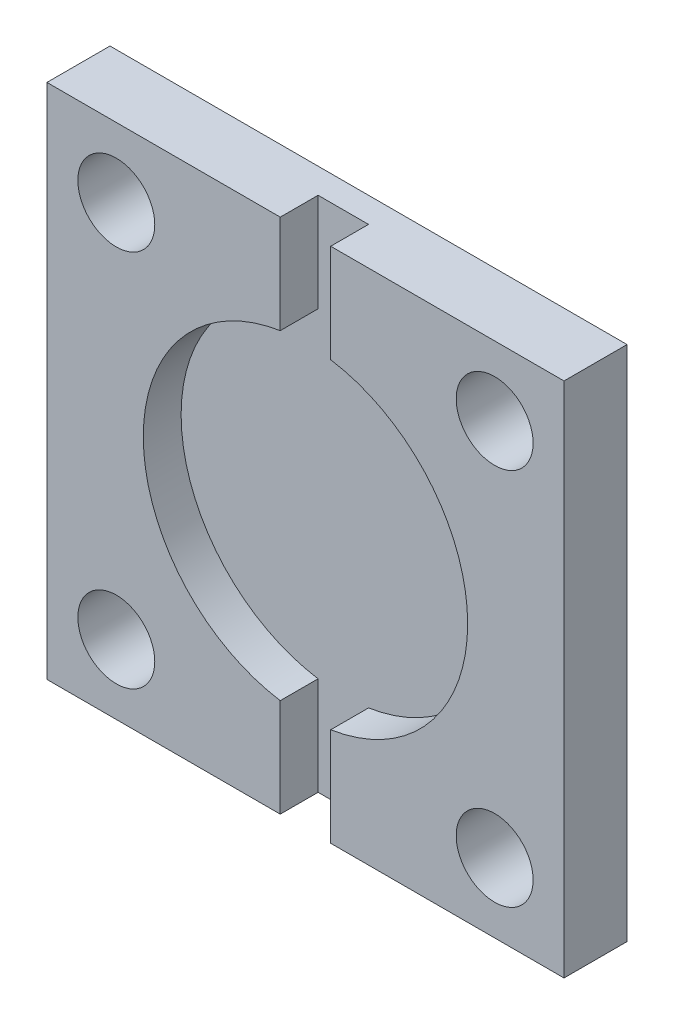
ISO-10303-21;
HEADER;
FILE_DESCRIPTION(('STEP AP214'),'2;1');
FILE_NAME('part.step','',(''),(''),'','','');
FILE_SCHEMA(('AUTOMOTIVE_DESIGN { 1 0 10303 214 1 1 1 1 }'));
ENDSEC;
DATA;
#1=APPLICATION_CONTEXT('core data for automotive mechanical design processes');
#2=APPLICATION_PROTOCOL_DEFINITION('international standard','automotive_design',2000,#1);
#3=PRODUCT_CONTEXT('',#1,'mechanical');
#4=PRODUCT('Part','Part','',(#3));
#5=PRODUCT_RELATED_PRODUCT_CATEGORY('part','',(#4));
#6=PRODUCT_DEFINITION_FORMATION('','',#4);
#7=PRODUCT_DEFINITION_CONTEXT('part definition',#1,'design');
#8=PRODUCT_DEFINITION('design','',#6,#7);
#9=PRODUCT_DEFINITION_SHAPE('','',#8);
#10=(LENGTH_UNIT() NAMED_UNIT(*) SI_UNIT(.MILLI.,.METRE.));
#11=(NAMED_UNIT(*) PLANE_ANGLE_UNIT() SI_UNIT($,.RADIAN.));
#12=(NAMED_UNIT(*) SI_UNIT($,.STERADIAN.) SOLID_ANGLE_UNIT());
#13=UNCERTAINTY_MEASURE_WITH_UNIT(LENGTH_MEASURE(1.E-05),#10,'distance_accuracy_value','');
#14=(GEOMETRIC_REPRESENTATION_CONTEXT(3) GLOBAL_UNCERTAINTY_ASSIGNED_CONTEXT((#13)) GLOBAL_UNIT_ASSIGNED_CONTEXT((#10,
#11,#12)) REPRESENTATION_CONTEXT('',''));
#15=CARTESIAN_POINT('',(0.,0.,0.));
#16=DIRECTION('',(0.,0.,1.));
#17=DIRECTION('',(1.,0.,0.));
#18=AXIS2_PLACEMENT_3D('',#15,#16,#17);
#19=CARTESIAN_POINT('',(-20.5,20.5,2.));
#20=DIRECTION('',(0.,0.,1.));
#21=DIRECTION('',(1.,0.,0.));
#22=AXIS2_PLACEMENT_3D('',#19,#20,#21);
#23=CYLINDRICAL_SURFACE('',#22,12.86);
#24=CARTESIAN_POINT('',(-20.5,20.5,5.));
#25=DIRECTION('',(0.,0.,1.));
#26=DIRECTION('',(1.,0.,0.));
#27=AXIS2_PLACEMENT_3D('',#24,#25,#26);
#28=CIRCLE('',#27,12.86);
#29=CARTESIAN_POINT('',(-18.5,7.79647293071723,5.));
#30=VERTEX_POINT('',#29);
#31=CARTESIAN_POINT('',(-18.5,33.2035270692828,5.));
#32=VERTEX_POINT('',#31);
#33=EDGE_CURVE('E173',#30,#32,#28,.T.);
#34=ORIENTED_EDGE('',*,*,#33,.T.);
#35=DIRECTION('',(0.,0.,1.));
#36=VECTOR('',#35,1.);
#37=CARTESIAN_POINT('',(-18.5,33.2035270692828,2.));
#38=LINE('',#37,#36);
#39=CARTESIAN_POINT('',(-18.5,33.2035270692828,2.));
#40=VERTEX_POINT('',#39);
#41=EDGE_CURVE('E155',#32,#40,#38,.F.);
#42=ORIENTED_EDGE('',*,*,#41,.T.);
#43=CARTESIAN_POINT('',(-20.5,20.5,2.));
#44=DIRECTION('',(0.,0.,1.));
#45=DIRECTION('',(1.,0.,0.));
#46=AXIS2_PLACEMENT_3D('',#43,#44,#45);
#47=CIRCLE('',#46,12.86);
#48=CARTESIAN_POINT('',(-18.5,7.79647293071723,2.));
#49=VERTEX_POINT('',#48);
#50=EDGE_CURVE('E162',#49,#40,#47,.T.);
#51=ORIENTED_EDGE('',*,*,#50,.F.);
#52=DIRECTION('',(0.,0.,1.));
#53=VECTOR('',#52,1.);
#54=CARTESIAN_POINT('',(-18.5,7.79647293071723,2.));
#55=LINE('',#54,#53);
#56=EDGE_CURVE('E478',#49,#30,#55,.T.);
#57=ORIENTED_EDGE('',*,*,#56,.T.);
#58=EDGE_LOOP('',(#34,#42,#51,#57));
#59=FACE_BOUND('',#58,.T.);
#60=ADVANCED_FACE('F39',(#59),#23,.F.);
#61=CARTESIAN_POINT('',(0.,0.,5.));
#62=DIRECTION('',(0.,0.,1.));
#63=DIRECTION('',(1.,0.,0.));
#64=AXIS2_PLACEMENT_3D('',#61,#62,#63);
#65=PLANE('',#64);
#66=CARTESIAN_POINT('',(-22.5,33.2035270692828,5.));
#67=VERTEX_POINT('',#66);
#68=CARTESIAN_POINT('',(-22.5,7.79647293071723,5.));
#69=VERTEX_POINT('',#68);
#70=EDGE_CURVE('E168',#67,#69,#28,.T.);
#71=ORIENTED_EDGE('',*,*,#70,.F.);
#72=DIRECTION('',(0.,-1.,0.));
#73=VECTOR('',#72,1.);
#74=CARTESIAN_POINT('',(-22.5,41.,5.));
#75=LINE('',#74,#73);
#76=CARTESIAN_POINT('',(-22.5,41.,5.));
#77=VERTEX_POINT('',#76);
#78=EDGE_CURVE('E148',#77,#67,#75,.T.);
#79=ORIENTED_EDGE('',*,*,#78,.F.);
#80=DIRECTION('',(-1.,0.,0.));
#81=VECTOR('',#80,1.);
#82=CARTESIAN_POINT('',(0.,41.,5.));
#83=LINE('',#82,#81);
#84=CARTESIAN_POINT('',(-41.,41.,5.));
#85=VERTEX_POINT('',#84);
#86=EDGE_CURVE('E84',#77,#85,#83,.T.);
#87=ORIENTED_EDGE('',*,*,#86,.T.);
#88=DIRECTION('',(0.,1.,0.));
#89=VECTOR('',#88,1.);
#90=CARTESIAN_POINT('',(-41.,0.,5.));
#91=LINE('',#90,#89);
#92=CARTESIAN_POINT('',(-41.,0.,5.));
#93=VERTEX_POINT('',#92);
#94=EDGE_CURVE('E177',#93,#85,#91,.T.);
#95=ORIENTED_EDGE('',*,*,#94,.F.);
#96=DIRECTION('',(-1.,0.,0.));
#97=VECTOR('',#96,1.);
#98=CARTESIAN_POINT('',(0.,0.,5.));
#99=LINE('',#98,#97);
#100=CARTESIAN_POINT('',(-22.5,0.,5.));
#101=VERTEX_POINT('',#100);
#102=EDGE_CURVE('E57',#101,#93,#99,.T.);
#103=ORIENTED_EDGE('',*,*,#102,.F.);
#104=DIRECTION('',(0.,-1.,0.));
#105=VECTOR('',#104,1.);
#106=CARTESIAN_POINT('',(-22.5,7.7277801459574,5.));
#107=LINE('',#106,#105);
#108=EDGE_CURVE('E225',#69,#101,#107,.T.);
#109=ORIENTED_EDGE('',*,*,#108,.F.);
#110=EDGE_LOOP('',(#71,#79,#87,#95,#103,#109));
#111=FACE_BOUND('',#110,.T.);
#112=CARTESIAN_POINT('',(-35.5,5.49999999999999,5.));
#113=DIRECTION('',(0.,0.,1.));
#114=DIRECTION('',(1.,0.,0.));
#115=AXIS2_PLACEMENT_3D('',#112,#113,#114);
#116=CIRCLE('',#115,3.05);
#117=CARTESIAN_POINT('',(-32.45,5.49999999999999,5.));
#118=VERTEX_POINT('',#117);
#119=EDGE_CURVE('E171',#118,#118,#116,.T.);
#120=ORIENTED_EDGE('',*,*,#119,.F.);
#121=EDGE_LOOP('',(#120));
#122=FACE_BOUND('',#121,.T.);
#123=CARTESIAN_POINT('',(-35.5,35.5,5.));
#124=DIRECTION('',(0.,0.,1.));
#125=DIRECTION('',(1.,0.,0.));
#126=AXIS2_PLACEMENT_3D('',#123,#124,#125);
#127=CIRCLE('',#126,3.05);
#128=CARTESIAN_POINT('',(-32.45,35.5,5.));
#129=VERTEX_POINT('',#128);
#130=EDGE_CURVE('E253',#129,#129,#127,.T.);
#131=ORIENTED_EDGE('',*,*,#130,.F.);
#132=EDGE_LOOP('',(#131));
#133=FACE_BOUND('',#132,.T.);
#134=ADVANCED_FACE('F265',(#111,#122,#133),#65,.T.);
#135=CARTESIAN_POINT('',(-41.,0.,5.));
#136=DIRECTION('',(-1.,0.,0.));
#137=DIRECTION('',(0.,0.,1.));
#138=AXIS2_PLACEMENT_3D('',#135,#136,#137);
#139=PLANE('',#138);
#140=DIRECTION('',(0.,1.,0.));
#141=VECTOR('',#140,1.);
#142=CARTESIAN_POINT('',(-41.,0.,0.));
#143=LINE('',#142,#141);
#144=CARTESIAN_POINT('',(-41.,0.,0.));
#145=VERTEX_POINT('',#144);
#146=CARTESIAN_POINT('',(-41.,41.,0.));
#147=VERTEX_POINT('',#146);
#148=EDGE_CURVE('E161',#145,#147,#143,.T.);
#149=ORIENTED_EDGE('',*,*,#148,.F.);
#150=DIRECTION('',(0.,0.,-1.));
#151=VECTOR('',#150,1.);
#152=CARTESIAN_POINT('',(-41.,0.,5.));
#153=LINE('',#152,#151);
#154=EDGE_CURVE('E11',#93,#145,#153,.T.);
#155=ORIENTED_EDGE('',*,*,#154,.F.);
#156=ORIENTED_EDGE('',*,*,#94,.T.);
#157=DIRECTION('',(0.,0.,-1.));
#158=VECTOR('',#157,1.);
#159=CARTESIAN_POINT('',(-41.,41.,5.));
#160=LINE('',#159,#158);
#161=EDGE_CURVE('E43',#85,#147,#160,.T.);
#162=ORIENTED_EDGE('',*,*,#161,.T.);
#163=EDGE_LOOP('',(#149,#155,#156,#162));
#164=FACE_BOUND('',#163,.T.);
#165=ADVANCED_FACE('F41',(#164),#139,.T.);
#166=CARTESIAN_POINT('',(0.,0.,5.));
#167=DIRECTION('',(0.,-1.,0.));
#168=DIRECTION('',(0.,0.,-1.));
#169=AXIS2_PLACEMENT_3D('',#166,#167,#168);
#170=PLANE('',#169);
#171=DIRECTION('',(1.,0.,0.));
#172=VECTOR('',#171,1.);
#173=CARTESIAN_POINT('',(-22.,0.,2.));
#174=LINE('',#173,#172);
#175=CARTESIAN_POINT('',(-22.5,0.,2.));
#176=VERTEX_POINT('',#175);
#177=CARTESIAN_POINT('',(-18.5,0.,2.));
#178=VERTEX_POINT('',#177);
#179=EDGE_CURVE('E237',#176,#178,#174,.T.);
#180=ORIENTED_EDGE('',*,*,#179,.F.);
#181=DIRECTION('',(0.,0.,-1.));
#182=VECTOR('',#181,1.);
#183=CARTESIAN_POINT('',(-22.5,0.,5.));
#184=LINE('',#183,#182);
#185=EDGE_CURVE('E219',#101,#176,#184,.T.);
#186=ORIENTED_EDGE('',*,*,#185,.F.);
#187=ORIENTED_EDGE('',*,*,#102,.T.);
#188=ORIENTED_EDGE('',*,*,#154,.T.);
#189=DIRECTION('',(-1.,0.,0.));
#190=VECTOR('',#189,1.);
#191=CARTESIAN_POINT('',(0.,0.,0.));
#192=LINE('',#191,#190);
#193=CARTESIAN_POINT('',(0.,0.,0.));
#194=VERTEX_POINT('',#193);
#195=EDGE_CURVE('E180',#194,#145,#192,.T.);
#196=ORIENTED_EDGE('',*,*,#195,.F.);
#197=DIRECTION('',(0.,0.,-1.));
#198=VECTOR('',#197,1.);
#199=CARTESIAN_POINT('',(0.,0.,5.));
#200=LINE('',#199,#198);
#201=CARTESIAN_POINT('',(0.,0.,5.));
#202=VERTEX_POINT('',#201);
#203=EDGE_CURVE('E49',#202,#194,#200,.T.);
#204=ORIENTED_EDGE('',*,*,#203,.F.);
#205=CARTESIAN_POINT('',(-18.5,0.,5.));
#206=VERTEX_POINT('',#205);
#207=EDGE_CURVE('E186',#202,#206,#99,.T.);
#208=ORIENTED_EDGE('',*,*,#207,.T.);
#209=DIRECTION('',(0.,0.,1.));
#210=VECTOR('',#209,1.);
#211=CARTESIAN_POINT('',(-18.5,0.,2.));
#212=LINE('',#211,#210);
#213=EDGE_CURVE('E222',#178,#206,#212,.T.);
#214=ORIENTED_EDGE('',*,*,#213,.F.);
#215=EDGE_LOOP('',(#180,#186,#187,#188,#196,#204,#208,#214));
#216=FACE_BOUND('',#215,.T.);
#217=ADVANCED_FACE('F205',(#216),#170,.T.);
#218=CARTESIAN_POINT('',(0.,0.,5.));
#219=DIRECTION('',(-1.,0.,0.));
#220=DIRECTION('',(0.,0.,1.));
#221=AXIS2_PLACEMENT_3D('',#218,#219,#220);
#222=PLANE('',#221);
#223=DIRECTION('',(0.,1.,0.));
#224=VECTOR('',#223,1.);
#225=CARTESIAN_POINT('',(0.,0.,0.));
#226=LINE('',#225,#224);
#227=CARTESIAN_POINT('',(0.,41.,0.));
#228=VERTEX_POINT('',#227);
#229=EDGE_CURVE('E191',#194,#228,#226,.T.);
#230=ORIENTED_EDGE('',*,*,#229,.T.);
#231=DIRECTION('',(0.,0.,-1.));
#232=VECTOR('',#231,1.);
#233=CARTESIAN_POINT('',(0.,41.,5.));
#234=LINE('',#233,#232);
#235=CARTESIAN_POINT('',(0.,41.,5.));
#236=VERTEX_POINT('',#235);
#237=EDGE_CURVE('E195',#236,#228,#234,.T.);
#238=ORIENTED_EDGE('',*,*,#237,.F.);
#239=DIRECTION('',(0.,1.,0.));
#240=VECTOR('',#239,1.);
#241=CARTESIAN_POINT('',(0.,0.,5.));
#242=LINE('',#241,#240);
#243=EDGE_CURVE('E184',#202,#236,#242,.T.);
#244=ORIENTED_EDGE('',*,*,#243,.F.);
#245=ORIENTED_EDGE('',*,*,#203,.T.);
#246=EDGE_LOOP('',(#230,#238,#244,#245));
#247=FACE_BOUND('',#246,.T.);
#248=ADVANCED_FACE('F208',(#247),#222,.F.);
#249=CARTESIAN_POINT('',(0.,41.,5.));
#250=DIRECTION('',(0.,-1.,0.));
#251=DIRECTION('',(0.,0.,-1.));
#252=AXIS2_PLACEMENT_3D('',#249,#250,#251);
#253=PLANE('',#252);
#254=DIRECTION('',(0.,0.,1.));
#255=VECTOR('',#254,1.);
#256=CARTESIAN_POINT('',(-22.5,41.,2.));
#257=LINE('',#256,#255);
#258=CARTESIAN_POINT('',(-22.5,41.,2.));
#259=VERTEX_POINT('',#258);
#260=EDGE_CURVE('E147',#259,#77,#257,.T.);
#261=ORIENTED_EDGE('',*,*,#260,.F.);
#262=DIRECTION('',(-1.,0.,0.));
#263=VECTOR('',#262,1.);
#264=CARTESIAN_POINT('',(-19.,41.,2.));
#265=LINE('',#264,#263);
#266=CARTESIAN_POINT('',(-18.5,41.,2.));
#267=VERTEX_POINT('',#266);
#268=EDGE_CURVE('E144',#267,#259,#265,.T.);
#269=ORIENTED_EDGE('',*,*,#268,.F.);
#270=DIRECTION('',(0.,0.,-1.));
#271=VECTOR('',#270,1.);
#272=CARTESIAN_POINT('',(-18.5,41.,5.));
#273=LINE('',#272,#271);
#274=CARTESIAN_POINT('',(-18.5,41.,5.));
#275=VERTEX_POINT('',#274);
#276=EDGE_CURVE('E232',#275,#267,#273,.T.);
#277=ORIENTED_EDGE('',*,*,#276,.F.);
#278=EDGE_CURVE('E181',#236,#275,#83,.T.);
#279=ORIENTED_EDGE('',*,*,#278,.F.);
#280=ORIENTED_EDGE('',*,*,#237,.T.);
#281=DIRECTION('',(-1.,0.,0.));
#282=VECTOR('',#281,1.);
#283=CARTESIAN_POINT('',(0.,41.,0.));
#284=LINE('',#283,#282);
#285=EDGE_CURVE('E165',#228,#147,#284,.T.);
#286=ORIENTED_EDGE('',*,*,#285,.T.);
#287=ORIENTED_EDGE('',*,*,#161,.F.);
#288=ORIENTED_EDGE('',*,*,#86,.F.);
#289=EDGE_LOOP('',(#261,#269,#277,#279,#280,#286,#287,#288));
#290=FACE_BOUND('',#289,.T.);
#291=ADVANCED_FACE('F202',(#290),#253,.F.);
#292=DIRECTION('',(0.,1.,0.));
#293=VECTOR('',#292,1.);
#294=CARTESIAN_POINT('',(-18.5,33.2722198540426,5.));
#295=LINE('',#294,#293);
#296=EDGE_CURVE('E230',#32,#275,#295,.T.);
#297=ORIENTED_EDGE('',*,*,#296,.F.);
#298=ORIENTED_EDGE('',*,*,#33,.F.);
#299=DIRECTION('',(0.,1.,0.));
#300=VECTOR('',#299,1.);
#301=CARTESIAN_POINT('',(-18.5,0.,5.));
#302=LINE('',#301,#300);
#303=EDGE_CURVE('E214',#206,#30,#302,.T.);
#304=ORIENTED_EDGE('',*,*,#303,.F.);
#305=ORIENTED_EDGE('',*,*,#207,.F.);
#306=ORIENTED_EDGE('',*,*,#243,.T.);
#307=ORIENTED_EDGE('',*,*,#278,.T.);
#308=EDGE_LOOP('',(#297,#298,#304,#305,#306,#307));
#309=FACE_BOUND('',#308,.T.);
#310=CARTESIAN_POINT('',(-5.5,35.5,5.));
#311=DIRECTION('',(0.,0.,1.));
#312=DIRECTION('',(1.,0.,0.));
#313=AXIS2_PLACEMENT_3D('',#310,#311,#312);
#314=CIRCLE('',#313,3.05);
#315=CARTESIAN_POINT('',(-2.45,35.5,5.));
#316=VERTEX_POINT('',#315);
#317=EDGE_CURVE('E247',#316,#316,#314,.T.);
#318=ORIENTED_EDGE('',*,*,#317,.F.);
#319=EDGE_LOOP('',(#318));
#320=FACE_BOUND('',#319,.T.);
#321=CARTESIAN_POINT('',(-5.5,5.49999999999999,5.));
#322=DIRECTION('',(0.,0.,1.));
#323=DIRECTION('',(1.,0.,0.));
#324=AXIS2_PLACEMENT_3D('',#321,#322,#323);
#325=CIRCLE('',#324,3.05);
#326=CARTESIAN_POINT('',(-2.45,5.49999999999999,5.));
#327=VERTEX_POINT('',#326);
#328=EDGE_CURVE('E241',#327,#327,#325,.T.);
#329=ORIENTED_EDGE('',*,*,#328,.F.);
#330=EDGE_LOOP('',(#329));
#331=FACE_BOUND('',#330,.T.);
#332=ADVANCED_FACE('F211',(#309,#320,#331),#65,.T.);
#333=CARTESIAN_POINT('',(0.,0.,0.));
#334=DIRECTION('',(0.,0.,1.));
#335=DIRECTION('',(1.,0.,0.));
#336=AXIS2_PLACEMENT_3D('',#333,#334,#335);
#337=PLANE('',#336);
#338=CARTESIAN_POINT('',(-35.5,35.5,0.));
#339=DIRECTION('',(0.,0.,1.));
#340=DIRECTION('',(1.,0.,0.));
#341=AXIS2_PLACEMENT_3D('',#338,#339,#340);
#342=CIRCLE('',#341,3.05);
#343=CARTESIAN_POINT('',(-32.45,35.5,0.));
#344=VERTEX_POINT('',#343);
#345=EDGE_CURVE('E240',#344,#344,#342,.T.);
#346=ORIENTED_EDGE('',*,*,#345,.T.);
#347=EDGE_LOOP('',(#346));
#348=FACE_BOUND('',#347,.T.);
#349=CARTESIAN_POINT('',(-5.5,35.5,0.));
#350=DIRECTION('',(0.,0.,1.));
#351=DIRECTION('',(1.,0.,0.));
#352=AXIS2_PLACEMENT_3D('',#349,#350,#351);
#353=CIRCLE('',#352,3.05);
#354=CARTESIAN_POINT('',(-2.45,35.5,0.));
#355=VERTEX_POINT('',#354);
#356=EDGE_CURVE('E250',#355,#355,#353,.T.);
#357=ORIENTED_EDGE('',*,*,#356,.T.);
#358=EDGE_LOOP('',(#357));
#359=FACE_BOUND('',#358,.T.);
#360=CARTESIAN_POINT('',(-5.5,5.49999999999999,0.));
#361=DIRECTION('',(0.,0.,1.));
#362=DIRECTION('',(1.,0.,0.));
#363=AXIS2_PLACEMENT_3D('',#360,#361,#362);
#364=CIRCLE('',#363,3.05);
#365=CARTESIAN_POINT('',(-2.45,5.49999999999999,0.));
#366=VERTEX_POINT('',#365);
#367=EDGE_CURVE('E244',#366,#366,#364,.T.);
#368=ORIENTED_EDGE('',*,*,#367,.T.);
#369=EDGE_LOOP('',(#368));
#370=FACE_BOUND('',#369,.T.);
#371=CARTESIAN_POINT('',(-35.5,5.49999999999999,0.));
#372=DIRECTION('',(0.,0.,1.));
#373=DIRECTION('',(1.,0.,0.));
#374=AXIS2_PLACEMENT_3D('',#371,#372,#373);
#375=CIRCLE('',#374,3.05);
#376=CARTESIAN_POINT('',(-32.45,5.49999999999999,0.));
#377=VERTEX_POINT('',#376);
#378=EDGE_CURVE('E176',#377,#377,#375,.T.);
#379=ORIENTED_EDGE('',*,*,#378,.T.);
#380=EDGE_LOOP('',(#379));
#381=FACE_BOUND('',#380,.T.);
#382=ORIENTED_EDGE('',*,*,#148,.T.);
#383=ORIENTED_EDGE('',*,*,#285,.F.);
#384=ORIENTED_EDGE('',*,*,#229,.F.);
#385=ORIENTED_EDGE('',*,*,#195,.T.);
#386=EDGE_LOOP('',(#382,#383,#384,#385));
#387=FACE_BOUND('',#386,.T.);
#388=ADVANCED_FACE('F204',(#348,#359,#370,#381,#387),#337,.F.);
#389=CARTESIAN_POINT('',(-22.5,33.2035270692828,2.));
#390=VERTEX_POINT('',#389);
#391=CARTESIAN_POINT('',(-22.5,7.79647293071723,2.));
#392=VERTEX_POINT('',#391);
#393=EDGE_CURVE('E141',#390,#392,#47,.T.);
#394=ORIENTED_EDGE('',*,*,#393,.F.);
#395=DIRECTION('',(0.,0.,1.));
#396=VECTOR('',#395,1.);
#397=CARTESIAN_POINT('',(-22.5,33.2035270692828,2.));
#398=LINE('',#397,#396);
#399=EDGE_CURVE('E151',#390,#67,#398,.T.);
#400=ORIENTED_EDGE('',*,*,#399,.T.);
#401=ORIENTED_EDGE('',*,*,#70,.T.);
#402=DIRECTION('',(0.,0.,1.));
#403=VECTOR('',#402,1.);
#404=CARTESIAN_POINT('',(-22.5,7.79647293071723,2.));
#405=LINE('',#404,#403);
#406=EDGE_CURVE('E160',#69,#392,#405,.F.);
#407=ORIENTED_EDGE('',*,*,#406,.T.);
#408=EDGE_LOOP('',(#394,#400,#401,#407));
#409=FACE_BOUND('',#408,.T.);
#410=ADVANCED_FACE('F158',(#409),#23,.F.);
#411=CARTESIAN_POINT('',(-20.5,20.5,2.));
#412=DIRECTION('',(0.,0.,1.));
#413=DIRECTION('',(1.,0.,0.));
#414=AXIS2_PLACEMENT_3D('',#411,#412,#413);
#415=PLANE('',#414);
#416=DIRECTION('',(0.,1.,0.));
#417=VECTOR('',#416,1.);
#418=CARTESIAN_POINT('',(-22.5,33.2722198540426,2.));
#419=LINE('',#418,#417);
#420=EDGE_CURVE('E136',#390,#259,#419,.T.);
#421=ORIENTED_EDGE('',*,*,#420,.F.);
#422=ORIENTED_EDGE('',*,*,#393,.T.);
#423=DIRECTION('',(0.,1.,0.));
#424=VECTOR('',#423,1.);
#425=CARTESIAN_POINT('',(-22.5,0.,2.));
#426=LINE('',#425,#424);
#427=EDGE_CURVE('E472',#176,#392,#426,.T.);
#428=ORIENTED_EDGE('',*,*,#427,.F.);
#429=ORIENTED_EDGE('',*,*,#179,.T.);
#430=DIRECTION('',(0.,-1.,0.));
#431=VECTOR('',#430,1.);
#432=CARTESIAN_POINT('',(-18.5,7.7277801459574,2.));
#433=LINE('',#432,#431);
#434=EDGE_CURVE('E218',#49,#178,#433,.T.);
#435=ORIENTED_EDGE('',*,*,#434,.F.);
#436=ORIENTED_EDGE('',*,*,#50,.T.);
#437=DIRECTION('',(0.,-1.,0.));
#438=VECTOR('',#437,1.);
#439=CARTESIAN_POINT('',(-18.5,41.,2.));
#440=LINE('',#439,#438);
#441=EDGE_CURVE('E235',#267,#40,#440,.T.);
#442=ORIENTED_EDGE('',*,*,#441,.F.);
#443=ORIENTED_EDGE('',*,*,#268,.T.);
#444=EDGE_LOOP('',(#421,#422,#428,#429,#435,#436,#442,#443));
#445=FACE_BOUND('',#444,.T.);
#446=ADVANCED_FACE('F138',(#445),#415,.T.);
#447=CARTESIAN_POINT('',(-35.5,5.49999999999999,0.));
#448=DIRECTION('',(0.,0.,1.));
#449=DIRECTION('',(1.,0.,0.));
#450=AXIS2_PLACEMENT_3D('',#447,#448,#449);
#451=CYLINDRICAL_SURFACE('',#450,3.05);
#452=ORIENTED_EDGE('',*,*,#378,.F.);
#453=EDGE_LOOP('',(#452));
#454=FACE_BOUND('',#453,.T.);
#455=ORIENTED_EDGE('',*,*,#119,.T.);
#456=EDGE_LOOP('',(#455));
#457=FACE_BOUND('',#456,.T.);
#458=ADVANCED_FACE('F263',(#454,#457),#451,.F.);
#459=CARTESIAN_POINT('',(-5.5,5.49999999999999,0.));
#460=DIRECTION('',(0.,0.,1.));
#461=DIRECTION('',(1.,0.,0.));
#462=AXIS2_PLACEMENT_3D('',#459,#460,#461);
#463=CYLINDRICAL_SURFACE('',#462,3.05);
#464=ORIENTED_EDGE('',*,*,#367,.F.);
#465=EDGE_LOOP('',(#464));
#466=FACE_BOUND('',#465,.T.);
#467=ORIENTED_EDGE('',*,*,#328,.T.);
#468=EDGE_LOOP('',(#467));
#469=FACE_BOUND('',#468,.T.);
#470=ADVANCED_FACE('F285',(#466,#469),#463,.F.);
#471=CARTESIAN_POINT('',(-5.5,35.5,0.));
#472=DIRECTION('',(0.,0.,1.));
#473=DIRECTION('',(1.,0.,0.));
#474=AXIS2_PLACEMENT_3D('',#471,#472,#473);
#475=CYLINDRICAL_SURFACE('',#474,3.05);
#476=ORIENTED_EDGE('',*,*,#356,.F.);
#477=EDGE_LOOP('',(#476));
#478=FACE_BOUND('',#477,.T.);
#479=ORIENTED_EDGE('',*,*,#317,.T.);
#480=EDGE_LOOP('',(#479));
#481=FACE_BOUND('',#480,.T.);
#482=ADVANCED_FACE('F274',(#478,#481),#475,.F.);
#483=CARTESIAN_POINT('',(-35.5,35.5,0.));
#484=DIRECTION('',(0.,0.,1.));
#485=DIRECTION('',(1.,0.,0.));
#486=AXIS2_PLACEMENT_3D('',#483,#484,#485);
#487=CYLINDRICAL_SURFACE('',#486,3.05);
#488=ORIENTED_EDGE('',*,*,#345,.F.);
#489=EDGE_LOOP('',(#488));
#490=FACE_BOUND('',#489,.T.);
#491=ORIENTED_EDGE('',*,*,#130,.T.);
#492=EDGE_LOOP('',(#491));
#493=FACE_BOUND('',#492,.T.);
#494=ADVANCED_FACE('F271',(#490,#493),#487,.F.);
#495=CARTESIAN_POINT('',(-18.5,0.,0.));
#496=DIRECTION('',(-1.,0.,0.));
#497=DIRECTION('',(0.,0.,1.));
#498=AXIS2_PLACEMENT_3D('',#495,#496,#497);
#499=PLANE('',#498);
#500=ORIENTED_EDGE('',*,*,#441,.T.);
#501=ORIENTED_EDGE('',*,*,#41,.F.);
#502=ORIENTED_EDGE('',*,*,#296,.T.);
#503=ORIENTED_EDGE('',*,*,#276,.T.);
#504=EDGE_LOOP('',(#500,#501,#502,#503));
#505=FACE_BOUND('',#504,.T.);
#506=ADVANCED_FACE('F273',(#505),#499,.T.);
#507=CARTESIAN_POINT('',(-18.5,0.,0.));
#508=DIRECTION('',(-1.,0.,0.));
#509=DIRECTION('',(0.,0.,1.));
#510=AXIS2_PLACEMENT_3D('',#507,#508,#509);
#511=PLANE('',#510);
#512=ORIENTED_EDGE('',*,*,#303,.T.);
#513=ORIENTED_EDGE('',*,*,#56,.F.);
#514=ORIENTED_EDGE('',*,*,#434,.T.);
#515=ORIENTED_EDGE('',*,*,#213,.T.);
#516=EDGE_LOOP('',(#512,#513,#514,#515));
#517=FACE_BOUND('',#516,.T.);
#518=ADVANCED_FACE('F282',(#517),#511,.T.);
#519=CARTESIAN_POINT('',(-22.5,0.,0.));
#520=DIRECTION('',(1.,0.,0.));
#521=DIRECTION('',(0.,0.,-1.));
#522=AXIS2_PLACEMENT_3D('',#519,#520,#521);
#523=PLANE('',#522);
#524=ORIENTED_EDGE('',*,*,#427,.T.);
#525=ORIENTED_EDGE('',*,*,#406,.F.);
#526=ORIENTED_EDGE('',*,*,#108,.T.);
#527=ORIENTED_EDGE('',*,*,#185,.T.);
#528=EDGE_LOOP('',(#524,#525,#526,#527));
#529=FACE_BOUND('',#528,.T.);
#530=ADVANCED_FACE('F323',(#529),#523,.T.);
#531=CARTESIAN_POINT('',(-22.5,0.,0.));
#532=DIRECTION('',(1.,0.,0.));
#533=DIRECTION('',(0.,0.,-1.));
#534=AXIS2_PLACEMENT_3D('',#531,#532,#533);
#535=PLANE('',#534);
#536=ORIENTED_EDGE('',*,*,#78,.T.);
#537=ORIENTED_EDGE('',*,*,#399,.F.);
#538=ORIENTED_EDGE('',*,*,#420,.T.);
#539=ORIENTED_EDGE('',*,*,#260,.T.);
#540=EDGE_LOOP('',(#536,#537,#538,#539));
#541=FACE_BOUND('',#540,.T.);
#542=ADVANCED_FACE('F152',(#541),#535,.T.);
#543=CLOSED_SHELL('',(#60,#134,#165,#217,#248,#291,#332,#388,#410,#446,#458,#470,#482,#494,#506,
#518,#530,#542));
#544=MANIFOLD_SOLID_BREP('B2',#543);
#545=ADVANCED_BREP_SHAPE_REPRESENTATION('',(#18,#544),#14);
#546=SHAPE_DEFINITION_REPRESENTATION(#9,#545);
ENDSEC;
END-ISO-10303-21;
